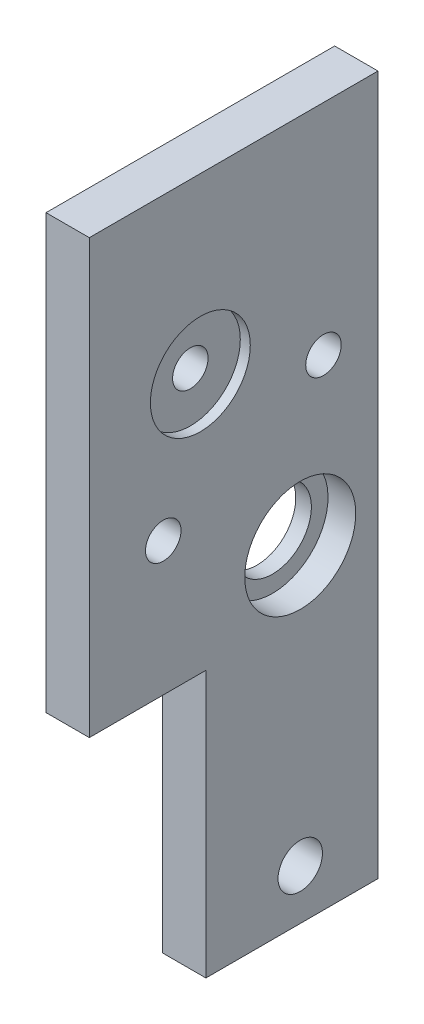
ISO-10303-21;
HEADER;
FILE_DESCRIPTION(('STEP AP214'),'2;1');
FILE_NAME('part.step','',(''),(''),'','','');
FILE_SCHEMA(('AUTOMOTIVE_DESIGN { 1 0 10303 214 1 1 1 1 }'));
ENDSEC;
DATA;
#1=APPLICATION_CONTEXT('core data for automotive mechanical design processes');
#2=APPLICATION_PROTOCOL_DEFINITION('international standard','automotive_design',2000,#1);
#3=PRODUCT_CONTEXT('',#1,'mechanical');
#4=PRODUCT('Part','Part','',(#3));
#5=PRODUCT_RELATED_PRODUCT_CATEGORY('part','',(#4));
#6=PRODUCT_DEFINITION_FORMATION('','',#4);
#7=PRODUCT_DEFINITION_CONTEXT('part definition',#1,'design');
#8=PRODUCT_DEFINITION('design','',#6,#7);
#9=PRODUCT_DEFINITION_SHAPE('','',#8);
#10=(LENGTH_UNIT() NAMED_UNIT(*) SI_UNIT(.MILLI.,.METRE.));
#11=(NAMED_UNIT(*) PLANE_ANGLE_UNIT() SI_UNIT($,.RADIAN.));
#12=(NAMED_UNIT(*) SI_UNIT($,.STERADIAN.) SOLID_ANGLE_UNIT());
#13=UNCERTAINTY_MEASURE_WITH_UNIT(LENGTH_MEASURE(1.E-05),#10,'distance_accuracy_value','');
#14=(GEOMETRIC_REPRESENTATION_CONTEXT(3) GLOBAL_UNCERTAINTY_ASSIGNED_CONTEXT((#13)) GLOBAL_UNIT_ASSIGNED_CONTEXT((#10,
#11,#12)) REPRESENTATION_CONTEXT('',''));
#15=CARTESIAN_POINT('',(0.,0.,0.));
#16=DIRECTION('',(0.,0.,1.));
#17=DIRECTION('',(1.,0.,0.));
#18=AXIS2_PLACEMENT_3D('',#15,#16,#17);
#19=CARTESIAN_POINT('',(-4.,29.5,7.));
#20=DIRECTION('',(1.,0.,0.));
#21=DIRECTION('',(0.,0.,-1.));
#22=AXIS2_PLACEMENT_3D('',#19,#20,#21);
#23=CYLINDRICAL_SURFACE('',#22,5.);
#24=CARTESIAN_POINT('',(3.9,29.5,7.));
#25=DIRECTION('',(-1.,0.,0.));
#26=DIRECTION('',(0.,-1.,0.));
#27=AXIS2_PLACEMENT_3D('',#24,#25,#26);
#28=CIRCLE('',#27,5.);
#29=CARTESIAN_POINT('',(3.9,24.5,7.));
#30=VERTEX_POINT('',#29);
#31=EDGE_CURVE('E185',#30,#30,#28,.F.);
#32=ORIENTED_EDGE('',*,*,#31,.T.);
#33=EDGE_LOOP('',(#32));
#34=FACE_BOUND('',#33,.T.);
#35=CARTESIAN_POINT('',(1.4,29.5,7.));
#36=DIRECTION('',(-1.,0.,0.));
#37=DIRECTION('',(0.,0.,1.));
#38=AXIS2_PLACEMENT_3D('',#35,#36,#37);
#39=CIRCLE('',#38,5.);
#40=CARTESIAN_POINT('',(1.4,29.5,12.));
#41=VERTEX_POINT('',#40);
#42=EDGE_CURVE('E13',#41,#41,#39,.F.);
#43=ORIENTED_EDGE('',*,*,#42,.F.);
#44=EDGE_LOOP('',(#43));
#45=FACE_BOUND('',#44,.T.);
#46=ADVANCED_FACE('F45',(#34,#45),#23,.F.);
#47=CARTESIAN_POINT('',(-4.,0.,0.));
#48=DIRECTION('',(0.,-1.,0.));
#49=DIRECTION('',(0.,0.,-1.));
#50=AXIS2_PLACEMENT_3D('',#47,#48,#49);
#51=PLANE('',#50);
#52=DIRECTION('',(0.,0.,-1.));
#53=VECTOR('',#52,1.);
#54=CARTESIAN_POINT('',(3.89999999999999,0.,26.));
#55=LINE('',#54,#53);
#56=CARTESIAN_POINT('',(3.89999999999999,0.,15.5));
#57=VERTEX_POINT('',#56);
#58=CARTESIAN_POINT('',(3.89999999999999,0.,0.));
#59=VERTEX_POINT('',#58);
#60=EDGE_CURVE('E96',#57,#59,#55,.T.);
#61=ORIENTED_EDGE('',*,*,#60,.F.);
#62=DIRECTION('',(1.,0.,0.));
#63=VECTOR('',#62,1.);
#64=CARTESIAN_POINT('',(-4.,0.,15.5));
#65=LINE('',#64,#63);
#66=CARTESIAN_POINT('',(0.,0.,15.5));
#67=VERTEX_POINT('',#66);
#68=EDGE_CURVE('E126',#67,#57,#65,.T.);
#69=ORIENTED_EDGE('',*,*,#68,.F.);
#70=DIRECTION('',(0.,0.,-1.));
#71=VECTOR('',#70,1.);
#72=CARTESIAN_POINT('',(0.,0.,0.));
#73=LINE('',#72,#71);
#74=CARTESIAN_POINT('',(0.,0.,0.));
#75=VERTEX_POINT('',#74);
#76=EDGE_CURVE('E119',#67,#75,#73,.T.);
#77=ORIENTED_EDGE('',*,*,#76,.T.);
#78=DIRECTION('',(1.,0.,0.));
#79=VECTOR('',#78,1.);
#80=CARTESIAN_POINT('',(-4.,0.,0.));
#81=LINE('',#80,#79);
#82=EDGE_CURVE('E112',#75,#59,#81,.T.);
#83=ORIENTED_EDGE('',*,*,#82,.T.);
#84=EDGE_LOOP('',(#61,#69,#77,#83));
#85=FACE_BOUND('',#84,.T.);
#86=ADVANCED_FACE('F118',(#85),#51,.T.);
#87=CARTESIAN_POINT('',(-4.,0.,0.));
#88=DIRECTION('',(0.,0.,-1.));
#89=DIRECTION('',(0.,1.,0.));
#90=AXIS2_PLACEMENT_3D('',#87,#88,#89);
#91=PLANE('',#90);
#92=DIRECTION('',(0.,1.,0.));
#93=VECTOR('',#92,1.);
#94=CARTESIAN_POINT('',(3.9,63.,0.));
#95=LINE('',#94,#93);
#96=CARTESIAN_POINT('',(3.9,63.,0.));
#97=VERTEX_POINT('',#96);
#98=EDGE_CURVE('E100',#59,#97,#95,.T.);
#99=ORIENTED_EDGE('',*,*,#98,.F.);
#100=ORIENTED_EDGE('',*,*,#82,.F.);
#101=DIRECTION('',(0.,1.,0.));
#102=VECTOR('',#101,1.);
#103=CARTESIAN_POINT('',(0.,0.,0.));
#104=LINE('',#103,#102);
#105=CARTESIAN_POINT('',(0.,63.,0.));
#106=VERTEX_POINT('',#105);
#107=EDGE_CURVE('E172',#75,#106,#104,.T.);
#108=ORIENTED_EDGE('',*,*,#107,.T.);
#109=DIRECTION('',(1.,0.,0.));
#110=VECTOR('',#109,1.);
#111=CARTESIAN_POINT('',(-4.,63.,0.));
#112=LINE('',#111,#110);
#113=EDGE_CURVE('E114',#106,#97,#112,.T.);
#114=ORIENTED_EDGE('',*,*,#113,.T.);
#115=EDGE_LOOP('',(#99,#100,#108,#114));
#116=FACE_BOUND('',#115,.T.);
#117=ADVANCED_FACE('F47',(#116),#91,.T.);
#118=CARTESIAN_POINT('',(-4.,63.,0.));
#119=DIRECTION('',(0.,1.,0.));
#120=DIRECTION('',(0.,0.,1.));
#121=AXIS2_PLACEMENT_3D('',#118,#119,#120);
#122=PLANE('',#121);
#123=DIRECTION('',(0.,0.,-1.));
#124=VECTOR('',#123,1.);
#125=CARTESIAN_POINT('',(3.9,63.,26.));
#126=LINE('',#125,#124);
#127=CARTESIAN_POINT('',(3.9,63.,26.));
#128=VERTEX_POINT('',#127);
#129=EDGE_CURVE('E60',#128,#97,#126,.T.);
#130=ORIENTED_EDGE('',*,*,#129,.T.);
#131=ORIENTED_EDGE('',*,*,#113,.F.);
#132=DIRECTION('',(0.,0.,-1.));
#133=VECTOR('',#132,1.);
#134=CARTESIAN_POINT('',(0.,63.,-5.81639869451733));
#135=LINE('',#134,#133);
#136=CARTESIAN_POINT('',(0.,63.,26.));
#137=VERTEX_POINT('',#136);
#138=EDGE_CURVE('E136',#137,#106,#135,.T.);
#139=ORIENTED_EDGE('',*,*,#138,.F.);
#140=DIRECTION('',(1.,0.,0.));
#141=VECTOR('',#140,1.);
#142=CARTESIAN_POINT('',(0.,63.,26.));
#143=LINE('',#142,#141);
#144=EDGE_CURVE('E67',#137,#128,#143,.T.);
#145=ORIENTED_EDGE('',*,*,#144,.T.);
#146=EDGE_LOOP('',(#130,#131,#139,#145));
#147=FACE_BOUND('',#146,.T.);
#148=ADVANCED_FACE('F135',(#147),#122,.T.);
#149=CARTESIAN_POINT('',(-4.,24.,30.));
#150=DIRECTION('',(0.,1.,0.));
#151=DIRECTION('',(0.,0.,1.));
#152=AXIS2_PLACEMENT_3D('',#149,#150,#151);
#153=PLANE('',#152);
#154=DIRECTION('',(1.,0.,0.));
#155=VECTOR('',#154,1.);
#156=CARTESIAN_POINT('',(-4.,24.,15.5));
#157=LINE('',#156,#155);
#158=CARTESIAN_POINT('',(0.,24.,15.5));
#159=VERTEX_POINT('',#158);
#160=CARTESIAN_POINT('',(3.9,24.,15.5));
#161=VERTEX_POINT('',#160);
#162=EDGE_CURVE('E123',#159,#161,#157,.T.);
#163=ORIENTED_EDGE('',*,*,#162,.T.);
#164=DIRECTION('',(0.,0.,1.));
#165=VECTOR('',#164,1.);
#166=CARTESIAN_POINT('',(3.9,24.,30.));
#167=LINE('',#166,#165);
#168=CARTESIAN_POINT('',(3.9,24.,26.));
#169=VERTEX_POINT('',#168);
#170=EDGE_CURVE('E184',#161,#169,#167,.T.);
#171=ORIENTED_EDGE('',*,*,#170,.T.);
#172=DIRECTION('',(1.,0.,0.));
#173=VECTOR('',#172,1.);
#174=CARTESIAN_POINT('',(0.,24.,26.));
#175=LINE('',#174,#173);
#176=CARTESIAN_POINT('',(0.,24.,26.));
#177=VERTEX_POINT('',#176);
#178=EDGE_CURVE('E131',#177,#169,#175,.T.);
#179=ORIENTED_EDGE('',*,*,#178,.F.);
#180=DIRECTION('',(0.,0.,1.));
#181=VECTOR('',#180,1.);
#182=CARTESIAN_POINT('',(0.,24.,30.));
#183=LINE('',#182,#181);
#184=EDGE_CURVE('E168',#159,#177,#183,.T.);
#185=ORIENTED_EDGE('',*,*,#184,.F.);
#186=EDGE_LOOP('',(#163,#171,#179,#185));
#187=FACE_BOUND('',#186,.T.);
#188=ADVANCED_FACE('F183',(#187),#153,.F.);
#189=CARTESIAN_POINT('',(-4.,0.,15.5));
#190=DIRECTION('',(0.,0.,-1.));
#191=DIRECTION('',(-1.,0.,0.));
#192=AXIS2_PLACEMENT_3D('',#189,#190,#191);
#193=PLANE('',#192);
#194=ORIENTED_EDGE('',*,*,#68,.T.);
#195=DIRECTION('',(0.,1.,0.));
#196=VECTOR('',#195,1.);
#197=CARTESIAN_POINT('',(3.89999999999999,0.,15.5));
#198=LINE('',#197,#196);
#199=EDGE_CURVE('E102',#57,#161,#198,.T.);
#200=ORIENTED_EDGE('',*,*,#199,.T.);
#201=ORIENTED_EDGE('',*,*,#162,.F.);
#202=DIRECTION('',(0.,1.,0.));
#203=VECTOR('',#202,1.);
#204=CARTESIAN_POINT('',(0.,0.,15.5));
#205=LINE('',#204,#203);
#206=EDGE_CURVE('E120',#67,#159,#205,.T.);
#207=ORIENTED_EDGE('',*,*,#206,.F.);
#208=EDGE_LOOP('',(#194,#200,#201,#207));
#209=FACE_BOUND('',#208,.T.);
#210=ADVANCED_FACE('F179',(#209),#193,.F.);
#211=CARTESIAN_POINT('',(0.,0.,0.));
#212=DIRECTION('',(-1.,0.,0.));
#213=DIRECTION('',(0.,0.,-1.));
#214=AXIS2_PLACEMENT_3D('',#211,#212,#213);
#215=PLANE('',#214);
#216=DIRECTION('',(0.,1.,0.));
#217=VECTOR('',#216,1.);
#218=CARTESIAN_POINT('',(0.,63.,26.));
#219=LINE('',#218,#217);
#220=EDGE_CURVE('E142',#177,#137,#219,.T.);
#221=ORIENTED_EDGE('',*,*,#220,.T.);
#222=ORIENTED_EDGE('',*,*,#138,.T.);
#223=ORIENTED_EDGE('',*,*,#107,.F.);
#224=ORIENTED_EDGE('',*,*,#76,.F.);
#225=ORIENTED_EDGE('',*,*,#206,.T.);
#226=ORIENTED_EDGE('',*,*,#184,.T.);
#227=EDGE_LOOP('',(#221,#222,#223,#224,#225,#226));
#228=FACE_BOUND('',#227,.T.);
#229=CARTESIAN_POINT('',(0.,36.0326086873371,19.3396657899873));
#230=DIRECTION('',(-1.,0.,0.));
#231=DIRECTION('',(0.,0.,1.));
#232=AXIS2_PLACEMENT_3D('',#229,#230,#231);
#233=CIRCLE('',#232,2.);
#234=CARTESIAN_POINT('',(0.,36.0326086873371,21.3396657899873));
#235=VERTEX_POINT('',#234);
#236=EDGE_CURVE('E137',#235,#235,#233,.T.);
#237=ORIENTED_EDGE('',*,*,#236,.F.);
#238=EDGE_LOOP('',(#237));
#239=FACE_BOUND('',#238,.T.);
#240=CARTESIAN_POINT('',(0.,43.3046086873371,4.90832434159794));
#241=DIRECTION('',(-1.,0.,0.));
#242=DIRECTION('',(0.,0.,1.));
#243=AXIS2_PLACEMENT_3D('',#240,#241,#242);
#244=CIRCLE('',#243,2.);
#245=CARTESIAN_POINT('',(0.,43.3046086873371,6.90832434159795));
#246=VERTEX_POINT('',#245);
#247=EDGE_CURVE('E149',#246,#246,#244,.T.);
#248=ORIENTED_EDGE('',*,*,#247,.F.);
#249=EDGE_LOOP('',(#248));
#250=FACE_BOUND('',#249,.T.);
#251=CARTESIAN_POINT('',(0.,47.3605710994917,16.));
#252=DIRECTION('',(1.,0.,0.));
#253=DIRECTION('',(0.,0.,-1.));
#254=AXIS2_PLACEMENT_3D('',#251,#252,#253);
#255=CIRCLE('',#254,1.6);
#256=CARTESIAN_POINT('',(0.,47.3605710994917,14.4));
#257=VERTEX_POINT('',#256);
#258=EDGE_CURVE('E161',#257,#257,#255,.T.);
#259=ORIENTED_EDGE('',*,*,#258,.T.);
#260=EDGE_LOOP('',(#259));
#261=FACE_BOUND('',#260,.T.);
#262=CARTESIAN_POINT('',(0.,4.5,7.));
#263=DIRECTION('',(-1.,0.,0.));
#264=DIRECTION('',(0.,0.,1.));
#265=AXIS2_PLACEMENT_3D('',#262,#263,#264);
#266=CIRCLE('',#265,1.99999999999999);
#267=CARTESIAN_POINT('',(0.,4.5,8.99999999999999));
#268=VERTEX_POINT('',#267);
#269=EDGE_CURVE('E164',#268,#268,#266,.T.);
#270=ORIENTED_EDGE('',*,*,#269,.F.);
#271=EDGE_LOOP('',(#270));
#272=FACE_BOUND('',#271,.T.);
#273=CARTESIAN_POINT('',(0.,29.5,7.));
#274=DIRECTION('',(-1.,0.,0.));
#275=DIRECTION('',(0.,0.,1.));
#276=AXIS2_PLACEMENT_3D('',#273,#274,#275);
#277=CIRCLE('',#276,3.5);
#278=CARTESIAN_POINT('',(0.,29.5,10.5));
#279=VERTEX_POINT('',#278);
#280=EDGE_CURVE('E203',#279,#279,#277,.T.);
#281=ORIENTED_EDGE('',*,*,#280,.F.);
#282=EDGE_LOOP('',(#281));
#283=FACE_BOUND('',#282,.T.);
#284=ADVANCED_FACE('F181',(#228,#239,#250,#261,#272,#283),#215,.T.);
#285=CARTESIAN_POINT('',(0.,4.5,7.));
#286=DIRECTION('',(-1.,0.,0.));
#287=DIRECTION('',(0.,0.,1.));
#288=AXIS2_PLACEMENT_3D('',#285,#286,#287);
#289=CYLINDRICAL_SURFACE('',#288,1.99999999999999);
#290=CARTESIAN_POINT('',(3.89999999999999,4.5,7.));
#291=DIRECTION('',(-1.,0.,0.));
#292=DIRECTION('',(0.,-1.,0.));
#293=AXIS2_PLACEMENT_3D('',#290,#291,#292);
#294=CIRCLE('',#293,1.99999999999999);
#295=CARTESIAN_POINT('',(3.89999999999999,2.50000000000001,7.));
#296=VERTEX_POINT('',#295);
#297=EDGE_CURVE('E188',#296,#296,#294,.F.);
#298=ORIENTED_EDGE('',*,*,#297,.T.);
#299=EDGE_LOOP('',(#298));
#300=FACE_BOUND('',#299,.T.);
#301=ORIENTED_EDGE('',*,*,#269,.T.);
#302=EDGE_LOOP('',(#301));
#303=FACE_BOUND('',#302,.T.);
#304=ADVANCED_FACE('F219',(#300,#303),#289,.F.);
#305=CARTESIAN_POINT('',(4.,47.3605710994917,16.));
#306=DIRECTION('',(1.,0.,0.));
#307=DIRECTION('',(0.,0.,-1.));
#308=AXIS2_PLACEMENT_3D('',#305,#306,#307);
#309=CYLINDRICAL_SURFACE('',#308,1.6);
#310=ORIENTED_EDGE('',*,*,#258,.F.);
#311=EDGE_LOOP('',(#310));
#312=FACE_BOUND('',#311,.T.);
#313=CARTESIAN_POINT('',(3.,47.3605710994917,16.));
#314=DIRECTION('',(1.,0.,0.));
#315=DIRECTION('',(0.,0.,-1.));
#316=AXIS2_PLACEMENT_3D('',#313,#314,#315);
#317=CIRCLE('',#316,1.60000000000001);
#318=CARTESIAN_POINT('',(3.,47.3605710994917,14.4));
#319=VERTEX_POINT('',#318);
#320=EDGE_CURVE('E158',#319,#319,#317,.T.);
#321=ORIENTED_EDGE('',*,*,#320,.T.);
#322=EDGE_LOOP('',(#321));
#323=FACE_BOUND('',#322,.T.);
#324=ADVANCED_FACE('F226',(#312,#323),#309,.F.);
#325=CARTESIAN_POINT('',(3.,48.9605710994918,16.));
#326=DIRECTION('',(-1.,0.,0.));
#327=DIRECTION('',(0.,0.,1.));
#328=AXIS2_PLACEMENT_3D('',#325,#326,#327);
#329=PLANE('',#328);
#330=ORIENTED_EDGE('',*,*,#320,.F.);
#331=EDGE_LOOP('',(#330));
#332=FACE_BOUND('',#331,.T.);
#333=CARTESIAN_POINT('',(3.,47.3605710994917,16.));
#334=DIRECTION('',(1.,0.,0.));
#335=DIRECTION('',(0.,0.,-1.));
#336=AXIS2_PLACEMENT_3D('',#333,#334,#335);
#337=CIRCLE('',#336,4.5);
#338=CARTESIAN_POINT('',(3.,47.3605710994917,11.5));
#339=VERTEX_POINT('',#338);
#340=EDGE_CURVE('E155',#339,#339,#337,.T.);
#341=ORIENTED_EDGE('',*,*,#340,.T.);
#342=EDGE_LOOP('',(#341));
#343=FACE_BOUND('',#342,.T.);
#344=ADVANCED_FACE('F287',(#332,#343),#329,.F.);
#345=CARTESIAN_POINT('',(4.,47.3605710994917,16.));
#346=DIRECTION('',(1.,0.,0.));
#347=DIRECTION('',(0.,0.,-1.));
#348=AXIS2_PLACEMENT_3D('',#345,#346,#347);
#349=CYLINDRICAL_SURFACE('',#348,4.5);
#350=CARTESIAN_POINT('',(3.9,47.3605710994917,16.));
#351=DIRECTION('',(-1.,0.,0.));
#352=DIRECTION('',(0.,-1.,0.));
#353=AXIS2_PLACEMENT_3D('',#350,#351,#352);
#354=CIRCLE('',#353,4.5);
#355=CARTESIAN_POINT('',(3.9,42.8605710994918,16.));
#356=VERTEX_POINT('',#355);
#357=EDGE_CURVE('E193',#356,#356,#354,.F.);
#358=ORIENTED_EDGE('',*,*,#357,.T.);
#359=EDGE_LOOP('',(#358));
#360=FACE_BOUND('',#359,.T.);
#361=ORIENTED_EDGE('',*,*,#340,.F.);
#362=EDGE_LOOP('',(#361));
#363=FACE_BOUND('',#362,.T.);
#364=ADVANCED_FACE('F292',(#360,#363),#349,.F.);
#365=CARTESIAN_POINT('',(0.,43.3046086873371,4.90832434159794));
#366=DIRECTION('',(-1.,0.,0.));
#367=DIRECTION('',(0.,0.,1.));
#368=AXIS2_PLACEMENT_3D('',#365,#366,#367);
#369=CYLINDRICAL_SURFACE('',#368,1.59999999999999);
#370=CARTESIAN_POINT('',(3.9,43.3046086873371,4.90832434159794));
#371=DIRECTION('',(-1.,0.,0.));
#372=DIRECTION('',(0.,-1.,0.));
#373=AXIS2_PLACEMENT_3D('',#370,#371,#372);
#374=CIRCLE('',#373,1.59999999999999);
#375=CARTESIAN_POINT('',(3.9,41.7046086873371,4.90832434159794));
#376=VERTEX_POINT('',#375);
#377=EDGE_CURVE('E196',#376,#376,#374,.F.);
#378=ORIENTED_EDGE('',*,*,#377,.T.);
#379=EDGE_LOOP('',(#378));
#380=FACE_BOUND('',#379,.T.);
#381=CARTESIAN_POINT('',(0.399999999999998,43.3046086873371,4.90832434159794));
#382=DIRECTION('',(-1.,0.,0.));
#383=DIRECTION('',(0.,0.,1.));
#384=AXIS2_PLACEMENT_3D('',#381,#382,#383);
#385=CIRCLE('',#384,1.59999999999999);
#386=CARTESIAN_POINT('',(0.399999999999998,43.3046086873371,6.50832434159793));
#387=VERTEX_POINT('',#386);
#388=EDGE_CURVE('E152',#387,#387,#385,.T.);
#389=ORIENTED_EDGE('',*,*,#388,.T.);
#390=EDGE_LOOP('',(#389));
#391=FACE_BOUND('',#390,.T.);
#392=ADVANCED_FACE('F279',(#380,#391),#369,.F.);
#393=CARTESIAN_POINT('',(0.,43.3046086873371,4.90832434159794));
#394=DIRECTION('',(-1.,0.,0.));
#395=DIRECTION('',(0.,0.,1.));
#396=AXIS2_PLACEMENT_3D('',#393,#394,#395);
#397=CONICAL_SURFACE('',#396,2.,0.785398163397463);
#398=ORIENTED_EDGE('',*,*,#388,.F.);
#399=EDGE_LOOP('',(#398));
#400=FACE_BOUND('',#399,.T.);
#401=ORIENTED_EDGE('',*,*,#247,.T.);
#402=EDGE_LOOP('',(#401));
#403=FACE_BOUND('',#402,.T.);
#404=ADVANCED_FACE('F274',(#400,#403),#397,.F.);
#405=CARTESIAN_POINT('',(0.,36.0326086873371,19.3396657899873));
#406=DIRECTION('',(-1.,0.,0.));
#407=DIRECTION('',(0.,0.,1.));
#408=AXIS2_PLACEMENT_3D('',#405,#406,#407);
#409=CYLINDRICAL_SURFACE('',#408,1.59999999999999);
#410=CARTESIAN_POINT('',(3.9,36.0326086873371,19.3396657899873));
#411=DIRECTION('',(-1.,0.,0.));
#412=DIRECTION('',(0.,-1.,0.));
#413=AXIS2_PLACEMENT_3D('',#410,#411,#412);
#414=CIRCLE('',#413,1.59999999999999);
#415=CARTESIAN_POINT('',(3.9,34.4326086873371,19.3396657899873));
#416=VERTEX_POINT('',#415);
#417=EDGE_CURVE('E199',#416,#416,#414,.F.);
#418=ORIENTED_EDGE('',*,*,#417,.T.);
#419=EDGE_LOOP('',(#418));
#420=FACE_BOUND('',#419,.T.);
#421=CARTESIAN_POINT('',(0.399999999999998,36.0326086873371,19.3396657899873));
#422=DIRECTION('',(-1.,0.,0.));
#423=DIRECTION('',(0.,0.,1.));
#424=AXIS2_PLACEMENT_3D('',#421,#422,#423);
#425=CIRCLE('',#424,1.59999999999999);
#426=CARTESIAN_POINT('',(0.399999999999998,36.0326086873371,20.9396657899873));
#427=VERTEX_POINT('',#426);
#428=EDGE_CURVE('E140',#427,#427,#425,.T.);
#429=ORIENTED_EDGE('',*,*,#428,.T.);
#430=EDGE_LOOP('',(#429));
#431=FACE_BOUND('',#430,.T.);
#432=ADVANCED_FACE('F264',(#420,#431),#409,.F.);
#433=CARTESIAN_POINT('',(0.,36.0326086873371,19.3396657899873));
#434=DIRECTION('',(-1.,0.,0.));
#435=DIRECTION('',(0.,0.,1.));
#436=AXIS2_PLACEMENT_3D('',#433,#434,#435);
#437=CONICAL_SURFACE('',#436,2.,0.785398163397463);
#438=ORIENTED_EDGE('',*,*,#428,.F.);
#439=EDGE_LOOP('',(#438));
#440=FACE_BOUND('',#439,.T.);
#441=ORIENTED_EDGE('',*,*,#236,.T.);
#442=EDGE_LOOP('',(#441));
#443=FACE_BOUND('',#442,.T.);
#444=ADVANCED_FACE('F259',(#440,#443),#437,.F.);
#445=CARTESIAN_POINT('',(0.,63.,26.));
#446=DIRECTION('',(0.,0.,-1.));
#447=DIRECTION('',(0.,1.,0.));
#448=AXIS2_PLACEMENT_3D('',#445,#446,#447);
#449=PLANE('',#448);
#450=ORIENTED_EDGE('',*,*,#178,.T.);
#451=DIRECTION('',(0.,1.,0.));
#452=VECTOR('',#451,1.);
#453=CARTESIAN_POINT('',(3.9,63.,26.));
#454=LINE('',#453,#452);
#455=EDGE_CURVE('E53',#169,#128,#454,.T.);
#456=ORIENTED_EDGE('',*,*,#455,.T.);
#457=ORIENTED_EDGE('',*,*,#144,.F.);
#458=ORIENTED_EDGE('',*,*,#220,.F.);
#459=EDGE_LOOP('',(#450,#456,#457,#458));
#460=FACE_BOUND('',#459,.T.);
#461=ADVANCED_FACE('F129',(#460),#449,.F.);
#462=CARTESIAN_POINT('',(3.9,63.,26.));
#463=DIRECTION('',(-1.,0.,0.));
#464=DIRECTION('',(0.,-1.,0.));
#465=AXIS2_PLACEMENT_3D('',#462,#463,#464);
#466=PLANE('',#465);
#467=ORIENTED_EDGE('',*,*,#199,.F.);
#468=ORIENTED_EDGE('',*,*,#60,.T.);
#469=ORIENTED_EDGE('',*,*,#98,.T.);
#470=ORIENTED_EDGE('',*,*,#129,.F.);
#471=ORIENTED_EDGE('',*,*,#455,.F.);
#472=ORIENTED_EDGE('',*,*,#170,.F.);
#473=EDGE_LOOP('',(#467,#468,#469,#470,#471,#472));
#474=FACE_BOUND('',#473,.T.);
#475=ORIENTED_EDGE('',*,*,#297,.F.);
#476=EDGE_LOOP('',(#475));
#477=FACE_BOUND('',#476,.T.);
#478=ORIENTED_EDGE('',*,*,#377,.F.);
#479=EDGE_LOOP('',(#478));
#480=FACE_BOUND('',#479,.T.);
#481=ORIENTED_EDGE('',*,*,#417,.F.);
#482=EDGE_LOOP('',(#481));
#483=FACE_BOUND('',#482,.T.);
#484=ORIENTED_EDGE('',*,*,#357,.F.);
#485=EDGE_LOOP('',(#484));
#486=FACE_BOUND('',#485,.T.);
#487=ORIENTED_EDGE('',*,*,#31,.F.);
#488=EDGE_LOOP('',(#487));
#489=FACE_BOUND('',#488,.T.);
#490=ADVANCED_FACE('F98',(#474,#477,#480,#483,#486,#489),#466,.F.);
#491=CARTESIAN_POINT('',(1.4,29.5,7.));
#492=DIRECTION('',(-1.,0.,0.));
#493=DIRECTION('',(0.,0.,1.));
#494=AXIS2_PLACEMENT_3D('',#491,#492,#493);
#495=PLANE('',#494);
#496=CARTESIAN_POINT('',(1.4,29.5,7.));
#497=DIRECTION('',(-1.,0.,0.));
#498=DIRECTION('',(0.,0.,1.));
#499=AXIS2_PLACEMENT_3D('',#496,#497,#498);
#500=CIRCLE('',#499,3.5);
#501=CARTESIAN_POINT('',(1.4,29.5,10.5));
#502=VERTEX_POINT('',#501);
#503=EDGE_CURVE('E115',#502,#502,#500,.T.);
#504=ORIENTED_EDGE('',*,*,#503,.T.);
#505=EDGE_LOOP('',(#504));
#506=FACE_BOUND('',#505,.T.);
#507=ORIENTED_EDGE('',*,*,#42,.T.);
#508=EDGE_LOOP('',(#507));
#509=FACE_BOUND('',#508,.T.);
#510=ADVANCED_FACE('F209',(#506,#509),#495,.F.);
#511=CARTESIAN_POINT('',(1.4,29.5,7.));
#512=DIRECTION('',(-1.,0.,0.));
#513=DIRECTION('',(0.,0.,1.));
#514=AXIS2_PLACEMENT_3D('',#511,#512,#513);
#515=CYLINDRICAL_SURFACE('',#514,3.5);
#516=ORIENTED_EDGE('',*,*,#503,.F.);
#517=EDGE_LOOP('',(#516));
#518=FACE_BOUND('',#517,.T.);
#519=ORIENTED_EDGE('',*,*,#280,.T.);
#520=EDGE_LOOP('',(#519));
#521=FACE_BOUND('',#520,.T.);
#522=ADVANCED_FACE('F212',(#518,#521),#515,.F.);
#523=CLOSED_SHELL('',(#46,#86,#117,#148,#188,#210,#284,#304,#324,#344,#364,#392,#404,#432,#444,
#461,#490,#510,#522));
#524=MANIFOLD_SOLID_BREP('B2',#523);
#525=ADVANCED_BREP_SHAPE_REPRESENTATION('',(#18,#524),#14);
#526=SHAPE_DEFINITION_REPRESENTATION(#9,#525);
ENDSEC;
END-ISO-10303-21;
